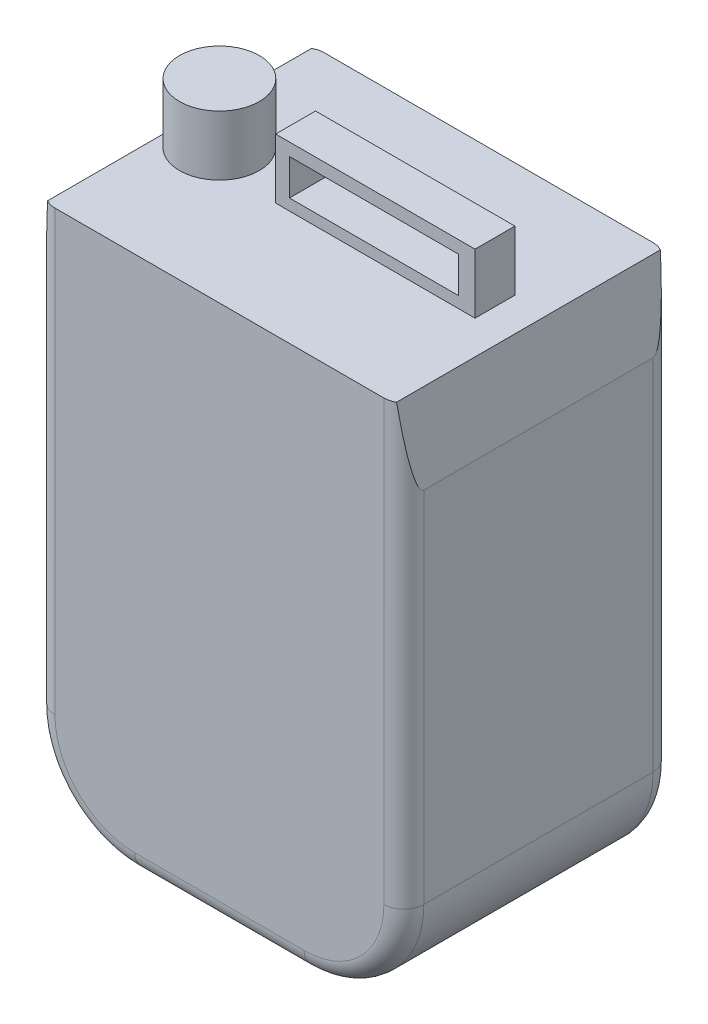
ISO-10303-21;
HEADER;
FILE_DESCRIPTION(('STEP AP214'),'2;1');
FILE_NAME('part.step','',(''),(''),'','','');
FILE_SCHEMA(('AUTOMOTIVE_DESIGN { 1 0 10303 214 1 1 1 1 }'));
ENDSEC;
DATA;
#1=APPLICATION_CONTEXT('core data for automotive mechanical design processes');
#2=APPLICATION_PROTOCOL_DEFINITION('international standard','automotive_design',2000,#1);
#3=PRODUCT_CONTEXT('',#1,'mechanical');
#4=PRODUCT('Part','Part','',(#3));
#5=PRODUCT_RELATED_PRODUCT_CATEGORY('part','',(#4));
#6=PRODUCT_DEFINITION_FORMATION('','',#4);
#7=PRODUCT_DEFINITION_CONTEXT('part definition',#1,'design');
#8=PRODUCT_DEFINITION('design','',#6,#7);
#9=PRODUCT_DEFINITION_SHAPE('','',#8);
#10=(LENGTH_UNIT() NAMED_UNIT(*) SI_UNIT(.MILLI.,.METRE.));
#11=(NAMED_UNIT(*) PLANE_ANGLE_UNIT() SI_UNIT($,.RADIAN.));
#12=(NAMED_UNIT(*) SI_UNIT($,.STERADIAN.) SOLID_ANGLE_UNIT());
#13=UNCERTAINTY_MEASURE_WITH_UNIT(LENGTH_MEASURE(1.E-05),#10,'distance_accuracy_value','');
#14=(GEOMETRIC_REPRESENTATION_CONTEXT(3) GLOBAL_UNCERTAINTY_ASSIGNED_CONTEXT((#13)) GLOBAL_UNIT_ASSIGNED_CONTEXT((#10,
#11,#12)) REPRESENTATION_CONTEXT('',''));
#15=CARTESIAN_POINT('',(0.,0.,0.));
#16=DIRECTION('',(0.,0.,1.));
#17=DIRECTION('',(1.,0.,0.));
#18=AXIS2_PLACEMENT_3D('',#15,#16,#17);
#19=CARTESIAN_POINT('',(-21.4692661721733,234.360279405971,135.));
#20=DIRECTION('',(0.,1.,0.));
#21=DIRECTION('',(0.,0.,1.));
#22=AXIS2_PLACEMENT_3D('',#19,#20,#21);
#23=PLANE('',#22);
#24=DIRECTION('',(1.,0.,0.));
#25=VECTOR('',#24,1.);
#26=CARTESIAN_POINT('',(-21.4692661721733,234.360279405971,0.));
#27=LINE('',#26,#25);
#28=CARTESIAN_POINT('',(-16.4692661721734,234.360279405971,0.));
#29=VERTEX_POINT('',#28);
#30=CARTESIAN_POINT('',(148.530733827827,234.360279405971,0.));
#31=VERTEX_POINT('',#30);
#32=EDGE_CURVE('E258',#29,#31,#27,.T.);
#33=ORIENTED_EDGE('',*,*,#32,.F.);
#34=CARTESIAN_POINT('',(-16.4692661721734,234.360279405971,10.));
#35=DIRECTION('',(0.,1.,0.));
#36=DIRECTION('',(0.,0.,1.));
#37=AXIS2_PLACEMENT_3D('',#34,#35,#36);
#38=CIRCLE('',#37,10.);
#39=CARTESIAN_POINT('',(-21.4692661721733,234.360279405971,1.33974596215564));
#40=VERTEX_POINT('',#39);
#41=EDGE_CURVE('E350',#29,#40,#38,.T.);
#42=ORIENTED_EDGE('',*,*,#41,.T.);
#43=DIRECTION('',(0.,0.,-1.));
#44=VECTOR('',#43,1.);
#45=CARTESIAN_POINT('',(-21.4692661721733,234.360279405971,135.));
#46=LINE('',#45,#44);
#47=CARTESIAN_POINT('',(-21.4692661721734,234.360279405971,67.5));
#48=VERTEX_POINT('',#47);
#49=EDGE_CURVE('E264',#48,#40,#46,.T.);
#50=ORIENTED_EDGE('',*,*,#49,.F.);
#51=CARTESIAN_POINT('',(-1.46926617217336,234.360279405971,67.5));
#52=DIRECTION('',(0.,1.,0.));
#53=DIRECTION('',(0.,0.,1.));
#54=AXIS2_PLACEMENT_3D('',#51,#52,#53);
#55=CIRCLE('',#54,20.);
#56=EDGE_CURVE('E254',#48,#48,#55,.T.);
#57=ORIENTED_EDGE('',*,*,#56,.F.);
#58=CARTESIAN_POINT('',(-21.4692661721733,234.360279405971,133.660254037844));
#59=VERTEX_POINT('',#58);
#60=EDGE_CURVE('E286',#59,#48,#46,.T.);
#61=ORIENTED_EDGE('',*,*,#60,.F.);
#62=CARTESIAN_POINT('',(-16.4692661721734,234.360279405971,125.));
#63=DIRECTION('',(0.,1.,0.));
#64=DIRECTION('',(0.,0.,1.));
#65=AXIS2_PLACEMENT_3D('',#62,#63,#64);
#66=CIRCLE('',#65,10.);
#67=CARTESIAN_POINT('',(-16.4692661721734,234.360279405971,135.));
#68=VERTEX_POINT('',#67);
#69=EDGE_CURVE('E312',#59,#68,#66,.T.);
#70=ORIENTED_EDGE('',*,*,#69,.T.);
#71=DIRECTION('',(1.,0.,0.));
#72=VECTOR('',#71,1.);
#73=CARTESIAN_POINT('',(-21.4692661721733,234.360279405971,135.));
#74=LINE('',#73,#72);
#75=CARTESIAN_POINT('',(148.530733827827,234.360279405971,135.));
#76=VERTEX_POINT('',#75);
#77=EDGE_CURVE('E261',#68,#76,#74,.T.);
#78=ORIENTED_EDGE('',*,*,#77,.T.);
#79=CARTESIAN_POINT('',(148.530733827827,234.360279405971,125.));
#80=DIRECTION('',(0.,1.,0.));
#81=DIRECTION('',(0.,0.,1.));
#82=AXIS2_PLACEMENT_3D('',#79,#80,#81);
#83=CIRCLE('',#82,10.);
#84=CARTESIAN_POINT('',(153.530733827827,234.360279405971,133.660254037844));
#85=VERTEX_POINT('',#84);
#86=EDGE_CURVE('E310',#76,#85,#83,.T.);
#87=ORIENTED_EDGE('',*,*,#86,.T.);
#88=DIRECTION('',(0.,0.,-1.));
#89=VECTOR('',#88,1.);
#90=CARTESIAN_POINT('',(153.530733827827,234.360279405971,135.));
#91=LINE('',#90,#89);
#92=CARTESIAN_POINT('',(153.530733827827,234.360279405971,1.33974596215563));
#93=VERTEX_POINT('',#92);
#94=EDGE_CURVE('E283',#85,#93,#91,.T.);
#95=ORIENTED_EDGE('',*,*,#94,.T.);
#96=CARTESIAN_POINT('',(148.530733827827,234.360279405971,10.));
#97=DIRECTION('',(0.,1.,0.));
#98=DIRECTION('',(0.,0.,1.));
#99=AXIS2_PLACEMENT_3D('',#96,#97,#98);
#100=CIRCLE('',#99,10.);
#101=EDGE_CURVE('E348',#93,#31,#100,.T.);
#102=ORIENTED_EDGE('',*,*,#101,.T.);
#103=EDGE_LOOP('',(#33,#42,#50,#57,#61,#70,#78,#87,#95,#102));
#104=FACE_BOUND('',#103,.T.);
#105=DIRECTION('',(1.,0.,0.));
#106=VECTOR('',#105,1.);
#107=CARTESIAN_POINT('',(36.7357267220525,234.360279405971,77.5));
#108=LINE('',#107,#106);
#109=CARTESIAN_POINT('',(36.7357267220525,234.360279405971,77.5));
#110=VERTEX_POINT('',#109);
#111=CARTESIAN_POINT('',(136.735726722053,234.360279405971,77.5));
#112=VERTEX_POINT('',#111);
#113=EDGE_CURVE('E239',#110,#112,#108,.T.);
#114=ORIENTED_EDGE('',*,*,#113,.F.);
#115=DIRECTION('',(0.,0.,1.));
#116=VECTOR('',#115,1.);
#117=CARTESIAN_POINT('',(36.7357267220525,234.360279405971,57.5));
#118=LINE('',#117,#116);
#119=CARTESIAN_POINT('',(36.7357267220525,234.360279405971,57.5));
#120=VERTEX_POINT('',#119);
#121=EDGE_CURVE('E223',#120,#110,#118,.T.);
#122=ORIENTED_EDGE('',*,*,#121,.F.);
#123=DIRECTION('',(-1.,0.,0.));
#124=VECTOR('',#123,1.);
#125=CARTESIAN_POINT('',(36.7357267220525,234.360279405971,57.5));
#126=LINE('',#125,#124);
#127=CARTESIAN_POINT('',(136.735726722053,234.360279405971,57.5));
#128=VERTEX_POINT('',#127);
#129=EDGE_CURVE('E230',#128,#120,#126,.T.);
#130=ORIENTED_EDGE('',*,*,#129,.F.);
#131=DIRECTION('',(0.,0.,-1.));
#132=VECTOR('',#131,1.);
#133=CARTESIAN_POINT('',(136.735726722053,234.360279405971,57.5));
#134=LINE('',#133,#132);
#135=EDGE_CURVE('E241',#112,#128,#134,.T.);
#136=ORIENTED_EDGE('',*,*,#135,.F.);
#137=EDGE_LOOP('',(#114,#122,#130,#136));
#138=FACE_BOUND('',#137,.T.);
#139=ADVANCED_FACE('F35',(#104,#138),#23,.T.);
#140=CARTESIAN_POINT('',(-26.4692661721734,194.360279405971,135.));
#141=DIRECTION('',(-0.992277876713668,0.124034734589208,0.));
#142=DIRECTION('',(-0.124034734589208,-0.992277876713668,0.));
#143=AXIS2_PLACEMENT_3D('',#140,#141,#142);
#144=PLANE('',#143);
#145=ORIENTED_EDGE('',*,*,#49,.T.);
#146=CARTESIAN_POINT('',(-16.4692661721734,274.360279405971,10.));
#147=DIRECTION('',(-0.992277876713668,0.124034734589208,0.));
#148=DIRECTION('',(-0.124034734589208,-0.992277876713668,0.));
#149=AXIS2_PLACEMENT_3D('',#146,#147,#148);
#150=ELLIPSE('',#149,80.6225774829855,10.);
#151=CARTESIAN_POINT('',(-26.4692661721734,194.360279405971,10.));
#152=VERTEX_POINT('',#151);
#153=EDGE_CURVE('E352',#40,#152,#150,.T.);
#154=ORIENTED_EDGE('',*,*,#153,.T.);
#155=DIRECTION('',(0.,0.,-1.));
#156=VECTOR('',#155,1.);
#157=CARTESIAN_POINT('',(-26.4692661721734,194.360279405971,135.));
#158=LINE('',#157,#156);
#159=CARTESIAN_POINT('',(-26.4692661721734,194.360279405971,125.));
#160=VERTEX_POINT('',#159);
#161=EDGE_CURVE('E267',#160,#152,#158,.T.);
#162=ORIENTED_EDGE('',*,*,#161,.F.);
#163=CARTESIAN_POINT('',(-16.4692661721734,274.360279405971,125.));
#164=DIRECTION('',(-0.992277876713668,0.124034734589208,0.));
#165=DIRECTION('',(0.124034734589208,0.992277876713668,0.));
#166=AXIS2_PLACEMENT_3D('',#163,#164,#165);
#167=ELLIPSE('',#166,80.6225774829855,10.);
#168=EDGE_CURVE('E308',#160,#59,#167,.T.);
#169=ORIENTED_EDGE('',*,*,#168,.T.);
#170=ORIENTED_EDGE('',*,*,#60,.T.);
#171=EDGE_LOOP('',(#145,#154,#162,#169,#170));
#172=FACE_BOUND('',#171,.T.);
#173=ADVANCED_FACE('F435',(#172),#144,.T.);
#174=CARTESIAN_POINT('',(-26.4692661721734,194.360279405971,135.));
#175=DIRECTION('',(1.,0.,0.));
#176=DIRECTION('',(0.,1.,0.));
#177=AXIS2_PLACEMENT_3D('',#174,#175,#176);
#178=PLANE('',#177);
#179=ORIENTED_EDGE('',*,*,#161,.T.);
#180=DIRECTION('',(0.,-1.,0.));
#181=VECTOR('',#180,1.);
#182=CARTESIAN_POINT('',(-26.4692661721734,194.360279405971,10.));
#183=LINE('',#182,#181);
#184=CARTESIAN_POINT('',(-26.4692661721734,14.3602794059717,10.));
#185=VERTEX_POINT('',#184);
#186=EDGE_CURVE('E324',#152,#185,#183,.T.);
#187=ORIENTED_EDGE('',*,*,#186,.T.);
#188=DIRECTION('',(0.,0.,-1.));
#189=VECTOR('',#188,1.);
#190=CARTESIAN_POINT('',(-26.4692661721734,14.3602794059717,135.));
#191=LINE('',#190,#189);
#192=CARTESIAN_POINT('',(-26.4692661721734,14.3602794059717,125.));
#193=VERTEX_POINT('',#192);
#194=EDGE_CURVE('E271',#193,#185,#191,.T.);
#195=ORIENTED_EDGE('',*,*,#194,.F.);
#196=DIRECTION('',(0.,-1.,0.));
#197=VECTOR('',#196,1.);
#198=CARTESIAN_POINT('',(-26.4692661721734,194.360279405971,125.));
#199=LINE('',#198,#197);
#200=EDGE_CURVE('E306',#193,#160,#199,.F.);
#201=ORIENTED_EDGE('',*,*,#200,.T.);
#202=EDGE_LOOP('',(#179,#187,#195,#201));
#203=FACE_BOUND('',#202,.T.);
#204=ADVANCED_FACE('F421',(#203),#178,.F.);
#205=CARTESIAN_POINT('',(23.5307338278266,14.3602794059713,135.));
#206=DIRECTION('',(0.,0.,-1.));
#207=DIRECTION('',(-1.,0.,0.));
#208=AXIS2_PLACEMENT_3D('',#205,#206,#207);
#209=CYLINDRICAL_SURFACE('',#208,50.);
#210=ORIENTED_EDGE('',*,*,#194,.T.);
#211=CARTESIAN_POINT('',(23.5307338278266,14.3602794059713,10.));
#212=DIRECTION('',(0.,0.,1.));
#213=DIRECTION('',(1.,0.,0.));
#214=AXIS2_PLACEMENT_3D('',#211,#212,#213);
#215=CIRCLE('',#214,50.);
#216=CARTESIAN_POINT('',(23.530733827827,-35.6397205940287,10.));
#217=VERTEX_POINT('',#216);
#218=EDGE_CURVE('E354',#185,#217,#215,.T.);
#219=ORIENTED_EDGE('',*,*,#218,.T.);
#220=DIRECTION('',(0.,0.,-1.));
#221=VECTOR('',#220,1.);
#222=CARTESIAN_POINT('',(23.530733827827,-35.6397205940287,135.));
#223=LINE('',#222,#221);
#224=CARTESIAN_POINT('',(23.530733827827,-35.6397205940287,125.));
#225=VERTEX_POINT('',#224);
#226=EDGE_CURVE('E274',#225,#217,#223,.T.);
#227=ORIENTED_EDGE('',*,*,#226,.F.);
#228=CARTESIAN_POINT('',(23.5307338278266,14.3602794059713,125.));
#229=DIRECTION('',(0.,0.,1.));
#230=DIRECTION('',(1.,0.,0.));
#231=AXIS2_PLACEMENT_3D('',#228,#229,#230);
#232=CIRCLE('',#231,50.);
#233=EDGE_CURVE('E314',#225,#193,#232,.F.);
#234=ORIENTED_EDGE('',*,*,#233,.T.);
#235=EDGE_LOOP('',(#210,#219,#227,#234));
#236=FACE_BOUND('',#235,.T.);
#237=ADVANCED_FACE('F411',(#236),#209,.T.);
#238=CARTESIAN_POINT('',(23.530733827827,-35.6397205940287,135.));
#239=DIRECTION('',(0.,1.,0.));
#240=DIRECTION('',(0.,0.,1.));
#241=AXIS2_PLACEMENT_3D('',#238,#239,#240);
#242=PLANE('',#241);
#243=ORIENTED_EDGE('',*,*,#226,.T.);
#244=DIRECTION('',(1.,0.,0.));
#245=VECTOR('',#244,1.);
#246=CARTESIAN_POINT('',(23.530733827827,-35.6397205940287,10.));
#247=LINE('',#246,#245);
#248=CARTESIAN_POINT('',(108.530733827826,-35.6397205940287,10.));
#249=VERTEX_POINT('',#248);
#250=EDGE_CURVE('E356',#217,#249,#247,.T.);
#251=ORIENTED_EDGE('',*,*,#250,.T.);
#252=DIRECTION('',(0.,0.,-1.));
#253=VECTOR('',#252,1.);
#254=CARTESIAN_POINT('',(108.530733827826,-35.6397205940287,135.));
#255=LINE('',#254,#253);
#256=CARTESIAN_POINT('',(108.530733827826,-35.6397205940287,125.));
#257=VERTEX_POINT('',#256);
#258=EDGE_CURVE('E277',#257,#249,#255,.T.);
#259=ORIENTED_EDGE('',*,*,#258,.F.);
#260=DIRECTION('',(1.,0.,0.));
#261=VECTOR('',#260,1.);
#262=CARTESIAN_POINT('',(23.530733827827,-35.6397205940287,125.));
#263=LINE('',#262,#261);
#264=EDGE_CURVE('E316',#257,#225,#263,.F.);
#265=ORIENTED_EDGE('',*,*,#264,.T.);
#266=EDGE_LOOP('',(#243,#251,#259,#265));
#267=FACE_BOUND('',#266,.T.);
#268=ADVANCED_FACE('F409',(#267),#242,.F.);
#269=CARTESIAN_POINT('',(108.530733827827,14.3602794059713,135.));
#270=DIRECTION('',(0.,0.,-1.));
#271=DIRECTION('',(-1.,0.,0.));
#272=AXIS2_PLACEMENT_3D('',#269,#270,#271);
#273=CYLINDRICAL_SURFACE('',#272,50.);
#274=ORIENTED_EDGE('',*,*,#258,.T.);
#275=CARTESIAN_POINT('',(108.530733827827,14.3602794059713,10.));
#276=DIRECTION('',(0.,0.,1.));
#277=DIRECTION('',(1.,0.,0.));
#278=AXIS2_PLACEMENT_3D('',#275,#276,#277);
#279=CIRCLE('',#278,50.);
#280=CARTESIAN_POINT('',(158.530733827827,14.3602794059713,10.));
#281=VERTEX_POINT('',#280);
#282=EDGE_CURVE('E59',#249,#281,#279,.T.);
#283=ORIENTED_EDGE('',*,*,#282,.T.);
#284=DIRECTION('',(0.,0.,-1.));
#285=VECTOR('',#284,1.);
#286=CARTESIAN_POINT('',(158.530733827827,14.3602794059713,135.));
#287=LINE('',#286,#285);
#288=CARTESIAN_POINT('',(158.530733827827,14.3602794059713,125.));
#289=VERTEX_POINT('',#288);
#290=EDGE_CURVE('E279',#289,#281,#287,.T.);
#291=ORIENTED_EDGE('',*,*,#290,.F.);
#292=CARTESIAN_POINT('',(108.530733827827,14.3602794059713,125.));
#293=DIRECTION('',(0.,0.,1.));
#294=DIRECTION('',(1.,0.,0.));
#295=AXIS2_PLACEMENT_3D('',#292,#293,#294);
#296=CIRCLE('',#295,50.);
#297=EDGE_CURVE('E318',#289,#257,#296,.F.);
#298=ORIENTED_EDGE('',*,*,#297,.T.);
#299=EDGE_LOOP('',(#274,#283,#291,#298));
#300=FACE_BOUND('',#299,.T.);
#301=ADVANCED_FACE('F394',(#300),#273,.T.);
#302=CARTESIAN_POINT('',(158.530733827827,194.360279405971,135.));
#303=DIRECTION('',(1.,0.,0.));
#304=DIRECTION('',(0.,1.,0.));
#305=AXIS2_PLACEMENT_3D('',#302,#303,#304);
#306=PLANE('',#305);
#307=ORIENTED_EDGE('',*,*,#290,.T.);
#308=DIRECTION('',(0.,-1.,0.));
#309=VECTOR('',#308,1.);
#310=CARTESIAN_POINT('',(158.530733827827,194.360279405971,10.));
#311=LINE('',#310,#309);
#312=CARTESIAN_POINT('',(158.530733827827,194.360279405971,10.));
#313=VERTEX_POINT('',#312);
#314=EDGE_CURVE('E44',#281,#313,#311,.F.);
#315=ORIENTED_EDGE('',*,*,#314,.T.);
#316=DIRECTION('',(0.,0.,-1.));
#317=VECTOR('',#316,1.);
#318=CARTESIAN_POINT('',(158.530733827827,194.360279405971,135.));
#319=LINE('',#318,#317);
#320=CARTESIAN_POINT('',(158.530733827827,194.360279405971,125.));
#321=VERTEX_POINT('',#320);
#322=EDGE_CURVE('E281',#321,#313,#319,.T.);
#323=ORIENTED_EDGE('',*,*,#322,.F.);
#324=DIRECTION('',(0.,-1.,0.));
#325=VECTOR('',#324,1.);
#326=CARTESIAN_POINT('',(158.530733827827,194.360279405971,125.));
#327=LINE('',#326,#325);
#328=EDGE_CURVE('E320',#321,#289,#327,.T.);
#329=ORIENTED_EDGE('',*,*,#328,.T.);
#330=EDGE_LOOP('',(#307,#315,#323,#329));
#331=FACE_BOUND('',#330,.T.);
#332=ADVANCED_FACE('F393',(#331),#306,.T.);
#333=CARTESIAN_POINT('',(153.530733827827,234.360279405971,135.));
#334=DIRECTION('',(0.992277876713668,0.124034734589207,0.));
#335=DIRECTION('',(-0.124034734589207,0.992277876713668,0.));
#336=AXIS2_PLACEMENT_3D('',#333,#334,#335);
#337=PLANE('',#336);
#338=ORIENTED_EDGE('',*,*,#322,.T.);
#339=CARTESIAN_POINT('',(148.530733827827,274.360279405972,10.));
#340=DIRECTION('',(0.992277876713668,0.124034734589207,0.));
#341=DIRECTION('',(-0.124034734589207,0.992277876713668,0.));
#342=AXIS2_PLACEMENT_3D('',#339,#340,#341);
#343=ELLIPSE('',#342,80.6225774829865,10.);
#344=EDGE_CURVE('E11',#313,#93,#343,.T.);
#345=ORIENTED_EDGE('',*,*,#344,.T.);
#346=ORIENTED_EDGE('',*,*,#94,.F.);
#347=CARTESIAN_POINT('',(148.530733827827,274.360279405972,125.));
#348=DIRECTION('',(0.992277876713668,0.124034734589207,0.));
#349=DIRECTION('',(0.124034734589207,-0.992277876713668,0.));
#350=AXIS2_PLACEMENT_3D('',#347,#348,#349);
#351=ELLIPSE('',#350,80.6225774829865,10.);
#352=EDGE_CURVE('E322',#85,#321,#351,.T.);
#353=ORIENTED_EDGE('',*,*,#352,.T.);
#354=EDGE_LOOP('',(#338,#345,#346,#353));
#355=FACE_BOUND('',#354,.T.);
#356=ADVANCED_FACE('F381',(#355),#337,.T.);
#357=CARTESIAN_POINT('',(108.530733827827,14.3602794059713,135.));
#358=DIRECTION('',(0.,0.,1.));
#359=DIRECTION('',(1.,0.,0.));
#360=AXIS2_PLACEMENT_3D('',#357,#358,#359);
#361=PLANE('',#360);
#362=ORIENTED_EDGE('',*,*,#77,.F.);
#363=DIRECTION('',(0.,-1.,0.));
#364=VECTOR('',#363,1.);
#365=CARTESIAN_POINT('',(-16.4692661721734,14.3602794059717,135.));
#366=LINE('',#365,#364);
#367=CARTESIAN_POINT('',(-16.4692661721734,14.3602794059717,135.));
#368=VERTEX_POINT('',#367);
#369=EDGE_CURVE('E303',#68,#368,#366,.T.);
#370=ORIENTED_EDGE('',*,*,#369,.T.);
#371=CARTESIAN_POINT('',(23.5307338278266,14.3602794059713,135.));
#372=DIRECTION('',(0.,0.,1.));
#373=DIRECTION('',(1.,0.,0.));
#374=AXIS2_PLACEMENT_3D('',#371,#372,#373);
#375=CIRCLE('',#374,40.);
#376=CARTESIAN_POINT('',(23.5307338278269,-25.6397205940287,135.));
#377=VERTEX_POINT('',#376);
#378=EDGE_CURVE('E301',#368,#377,#375,.T.);
#379=ORIENTED_EDGE('',*,*,#378,.T.);
#380=DIRECTION('',(1.,0.,0.));
#381=VECTOR('',#380,1.);
#382=CARTESIAN_POINT('',(108.530733827826,-25.6397205940287,135.));
#383=LINE('',#382,#381);
#384=CARTESIAN_POINT('',(108.530733827826,-25.6397205940287,135.));
#385=VERTEX_POINT('',#384);
#386=EDGE_CURVE('E299',#377,#385,#383,.T.);
#387=ORIENTED_EDGE('',*,*,#386,.T.);
#388=CARTESIAN_POINT('',(108.530733827827,14.3602794059713,135.));
#389=DIRECTION('',(0.,0.,1.));
#390=DIRECTION('',(1.,0.,0.));
#391=AXIS2_PLACEMENT_3D('',#388,#389,#390);
#392=CIRCLE('',#391,40.);
#393=CARTESIAN_POINT('',(148.530733827827,14.3602794059713,135.));
#394=VERTEX_POINT('',#393);
#395=EDGE_CURVE('E297',#385,#394,#392,.T.);
#396=ORIENTED_EDGE('',*,*,#395,.T.);
#397=DIRECTION('',(0.,-1.,0.));
#398=VECTOR('',#397,1.);
#399=CARTESIAN_POINT('',(148.530733827827,14.3602794059713,135.));
#400=LINE('',#399,#398);
#401=EDGE_CURVE('E295',#394,#76,#400,.F.);
#402=ORIENTED_EDGE('',*,*,#401,.T.);
#403=EDGE_LOOP('',(#362,#370,#379,#387,#396,#402));
#404=FACE_BOUND('',#403,.T.);
#405=ADVANCED_FACE('F445',(#404),#361,.T.);
#406=CARTESIAN_POINT('',(108.530733827827,14.3602794059713,0.));
#407=DIRECTION('',(0.,0.,1.));
#408=DIRECTION('',(1.,0.,0.));
#409=AXIS2_PLACEMENT_3D('',#406,#407,#408);
#410=PLANE('',#409);
#411=CARTESIAN_POINT('',(23.5307338278266,14.3602794059713,0.));
#412=DIRECTION('',(0.,0.,1.));
#413=DIRECTION('',(1.,0.,0.));
#414=AXIS2_PLACEMENT_3D('',#411,#412,#413);
#415=CIRCLE('',#414,40.);
#416=CARTESIAN_POINT('',(23.5307338278269,-25.6397205940287,0.));
#417=VERTEX_POINT('',#416);
#418=CARTESIAN_POINT('',(-16.4692661721734,14.3602794059717,0.));
#419=VERTEX_POINT('',#418);
#420=EDGE_CURVE('E344',#417,#419,#415,.F.);
#421=ORIENTED_EDGE('',*,*,#420,.T.);
#422=DIRECTION('',(0.,-1.,0.));
#423=VECTOR('',#422,1.);
#424=CARTESIAN_POINT('',(-16.4692661721734,14.3602794059713,0.));
#425=LINE('',#424,#423);
#426=EDGE_CURVE('E346',#419,#29,#425,.F.);
#427=ORIENTED_EDGE('',*,*,#426,.T.);
#428=ORIENTED_EDGE('',*,*,#32,.T.);
#429=DIRECTION('',(0.,-1.,0.));
#430=VECTOR('',#429,1.);
#431=CARTESIAN_POINT('',(148.530733827827,14.3602794059713,0.));
#432=LINE('',#431,#430);
#433=CARTESIAN_POINT('',(148.530733827827,14.3602794059713,0.));
#434=VERTEX_POINT('',#433);
#435=EDGE_CURVE('E338',#31,#434,#432,.T.);
#436=ORIENTED_EDGE('',*,*,#435,.T.);
#437=CARTESIAN_POINT('',(108.530733827827,14.3602794059713,0.));
#438=DIRECTION('',(0.,0.,1.));
#439=DIRECTION('',(1.,0.,0.));
#440=AXIS2_PLACEMENT_3D('',#437,#438,#439);
#441=CIRCLE('',#440,40.);
#442=CARTESIAN_POINT('',(108.530733827826,-25.6397205940287,0.));
#443=VERTEX_POINT('',#442);
#444=EDGE_CURVE('E340',#434,#443,#441,.F.);
#445=ORIENTED_EDGE('',*,*,#444,.T.);
#446=DIRECTION('',(1.,0.,0.));
#447=VECTOR('',#446,1.);
#448=CARTESIAN_POINT('',(108.530733827827,-25.6397205940287,0.));
#449=LINE('',#448,#447);
#450=EDGE_CURVE('E342',#443,#417,#449,.F.);
#451=ORIENTED_EDGE('',*,*,#450,.T.);
#452=EDGE_LOOP('',(#421,#427,#428,#436,#445,#451));
#453=FACE_BOUND('',#452,.T.);
#454=ADVANCED_FACE('F430',(#453),#410,.F.);
#455=CARTESIAN_POINT('',(-1.46926617217336,264.360279405971,67.5));
#456=DIRECTION('',(0.,-1.,0.));
#457=DIRECTION('',(0.,0.,-1.));
#458=AXIS2_PLACEMENT_3D('',#455,#456,#457);
#459=CYLINDRICAL_SURFACE('',#458,20.);
#460=CARTESIAN_POINT('',(-1.46926617217336,264.360279405971,67.5));
#461=DIRECTION('',(0.,1.,0.));
#462=DIRECTION('',(0.,0.,1.));
#463=AXIS2_PLACEMENT_3D('',#460,#461,#462);
#464=CIRCLE('',#463,20.);
#465=CARTESIAN_POINT('',(-1.46926617217336,264.360279405971,87.5));
#466=VERTEX_POINT('',#465);
#467=EDGE_CURVE('E255',#466,#466,#464,.T.);
#468=ORIENTED_EDGE('',*,*,#467,.F.);
#469=EDGE_LOOP('',(#468));
#470=FACE_BOUND('',#469,.T.);
#471=ORIENTED_EDGE('',*,*,#56,.T.);
#472=EDGE_LOOP('',(#471));
#473=FACE_BOUND('',#472,.T.);
#474=ADVANCED_FACE('F477',(#470,#473),#459,.T.);
#475=CARTESIAN_POINT('',(-1.46926617217336,264.360279405971,67.5));
#476=DIRECTION('',(0.,1.,0.));
#477=DIRECTION('',(0.,0.,1.));
#478=AXIS2_PLACEMENT_3D('',#475,#476,#477);
#479=PLANE('',#478);
#480=ORIENTED_EDGE('',*,*,#467,.T.);
#481=EDGE_LOOP('',(#480));
#482=FACE_BOUND('',#481,.T.);
#483=ADVANCED_FACE('F482',(#482),#479,.T.);
#484=CARTESIAN_POINT('',(36.7357267220525,264.360279405971,57.5));
#485=DIRECTION('',(1.,0.,0.));
#486=DIRECTION('',(0.,0.,-1.));
#487=AXIS2_PLACEMENT_3D('',#484,#485,#486);
#488=PLANE('',#487);
#489=ORIENTED_EDGE('',*,*,#121,.T.);
#490=DIRECTION('',(0.,-1.,0.));
#491=VECTOR('',#490,1.);
#492=CARTESIAN_POINT('',(36.7357267220525,264.360279405971,77.5));
#493=LINE('',#492,#491);
#494=CARTESIAN_POINT('',(36.7357267220525,264.360279405971,77.5));
#495=VERTEX_POINT('',#494);
#496=EDGE_CURVE('E252',#495,#110,#493,.T.);
#497=ORIENTED_EDGE('',*,*,#496,.F.);
#498=DIRECTION('',(0.,0.,1.));
#499=VECTOR('',#498,1.);
#500=CARTESIAN_POINT('',(36.7357267220525,264.360279405971,57.5));
#501=LINE('',#500,#499);
#502=CARTESIAN_POINT('',(36.7357267220525,264.360279405971,57.5));
#503=VERTEX_POINT('',#502);
#504=EDGE_CURVE('E226',#503,#495,#501,.T.);
#505=ORIENTED_EDGE('',*,*,#504,.F.);
#506=DIRECTION('',(0.,-1.,0.));
#507=VECTOR('',#506,1.);
#508=CARTESIAN_POINT('',(36.7357267220525,264.360279405971,57.5));
#509=LINE('',#508,#507);
#510=EDGE_CURVE('E236',#503,#120,#509,.T.);
#511=ORIENTED_EDGE('',*,*,#510,.T.);
#512=EDGE_LOOP('',(#489,#497,#505,#511));
#513=FACE_BOUND('',#512,.T.);
#514=ADVANCED_FACE('F486',(#513),#488,.F.);
#515=CARTESIAN_POINT('',(36.7357267220525,264.360279405971,77.5));
#516=DIRECTION('',(0.,0.,-1.));
#517=DIRECTION('',(-1.,0.,0.));
#518=AXIS2_PLACEMENT_3D('',#515,#516,#517);
#519=PLANE('',#518);
#520=DIRECTION('',(1.,0.,0.));
#521=VECTOR('',#520,1.);
#522=CARTESIAN_POINT('',(43.6591354356621,240.030286499606,77.5));
#523=LINE('',#522,#521);
#524=CARTESIAN_POINT('',(43.6591354356621,240.030286499606,77.5));
#525=VERTEX_POINT('',#524);
#526=CARTESIAN_POINT('',(128.561296548875,240.030286499606,77.5));
#527=VERTEX_POINT('',#526);
#528=EDGE_CURVE('E206',#525,#527,#523,.T.);
#529=ORIENTED_EDGE('',*,*,#528,.F.);
#530=DIRECTION('',(0.,-1.,0.));
#531=VECTOR('',#530,1.);
#532=CARTESIAN_POINT('',(43.6591354356621,258.04524085346,77.5));
#533=LINE('',#532,#531);
#534=CARTESIAN_POINT('',(43.6591354356621,258.04524085346,77.5));
#535=VERTEX_POINT('',#534);
#536=EDGE_CURVE('E211',#535,#525,#533,.T.);
#537=ORIENTED_EDGE('',*,*,#536,.F.);
#538=DIRECTION('',(1.,0.,0.));
#539=VECTOR('',#538,1.);
#540=CARTESIAN_POINT('',(43.6591354356621,258.04524085346,77.5));
#541=LINE('',#540,#539);
#542=CARTESIAN_POINT('',(128.561296548875,258.04524085346,77.5));
#543=VERTEX_POINT('',#542);
#544=EDGE_CURVE('E216',#535,#543,#541,.T.);
#545=ORIENTED_EDGE('',*,*,#544,.T.);
#546=DIRECTION('',(0.,-1.,0.));
#547=VECTOR('',#546,1.);
#548=CARTESIAN_POINT('',(128.561296548875,258.04524085346,77.5));
#549=LINE('',#548,#547);
#550=EDGE_CURVE('E195',#543,#527,#549,.T.);
#551=ORIENTED_EDGE('',*,*,#550,.T.);
#552=EDGE_LOOP('',(#529,#537,#545,#551));
#553=FACE_BOUND('',#552,.T.);
#554=ORIENTED_EDGE('',*,*,#113,.T.);
#555=DIRECTION('',(0.,-1.,0.));
#556=VECTOR('',#555,1.);
#557=CARTESIAN_POINT('',(136.735726722053,264.360279405971,77.5));
#558=LINE('',#557,#556);
#559=CARTESIAN_POINT('',(136.735726722053,264.360279405971,77.5));
#560=VERTEX_POINT('',#559);
#561=EDGE_CURVE('E249',#560,#112,#558,.T.);
#562=ORIENTED_EDGE('',*,*,#561,.F.);
#563=DIRECTION('',(1.,0.,0.));
#564=VECTOR('',#563,1.);
#565=CARTESIAN_POINT('',(36.7357267220525,264.360279405971,77.5));
#566=LINE('',#565,#564);
#567=EDGE_CURVE('E229',#495,#560,#566,.T.);
#568=ORIENTED_EDGE('',*,*,#567,.F.);
#569=ORIENTED_EDGE('',*,*,#496,.T.);
#570=EDGE_LOOP('',(#554,#562,#568,#569));
#571=FACE_BOUND('',#570,.T.);
#572=ADVANCED_FACE('F213',(#553,#571),#519,.F.);
#573=CARTESIAN_POINT('',(136.735726722053,264.360279405971,57.5));
#574=DIRECTION('',(-1.,0.,0.));
#575=DIRECTION('',(0.,0.,1.));
#576=AXIS2_PLACEMENT_3D('',#573,#574,#575);
#577=PLANE('',#576);
#578=ORIENTED_EDGE('',*,*,#135,.T.);
#579=DIRECTION('',(0.,-1.,0.));
#580=VECTOR('',#579,1.);
#581=CARTESIAN_POINT('',(136.735726722053,264.360279405971,57.5));
#582=LINE('',#581,#580);
#583=CARTESIAN_POINT('',(136.735726722053,264.360279405971,57.5));
#584=VERTEX_POINT('',#583);
#585=EDGE_CURVE('E247',#584,#128,#582,.T.);
#586=ORIENTED_EDGE('',*,*,#585,.F.);
#587=DIRECTION('',(0.,0.,-1.));
#588=VECTOR('',#587,1.);
#589=CARTESIAN_POINT('',(136.735726722053,264.360279405971,57.5));
#590=LINE('',#589,#588);
#591=EDGE_CURVE('E232',#560,#584,#590,.T.);
#592=ORIENTED_EDGE('',*,*,#591,.F.);
#593=ORIENTED_EDGE('',*,*,#561,.T.);
#594=EDGE_LOOP('',(#578,#586,#592,#593));
#595=FACE_BOUND('',#594,.T.);
#596=ADVANCED_FACE('F493',(#595),#577,.F.);
#597=CARTESIAN_POINT('',(36.7357267220525,264.360279405971,57.5));
#598=DIRECTION('',(0.,0.,1.));
#599=DIRECTION('',(1.,0.,0.));
#600=AXIS2_PLACEMENT_3D('',#597,#598,#599);
#601=PLANE('',#600);
#602=DIRECTION('',(1.,0.,0.));
#603=VECTOR('',#602,1.);
#604=CARTESIAN_POINT('',(36.7357267220525,258.04524085346,57.5));
#605=LINE('',#604,#603);
#606=CARTESIAN_POINT('',(43.6591354356621,258.04524085346,57.5));
#607=VERTEX_POINT('',#606);
#608=CARTESIAN_POINT('',(128.561296548875,258.04524085346,57.5));
#609=VERTEX_POINT('',#608);
#610=EDGE_CURVE('E290',#607,#609,#605,.T.);
#611=ORIENTED_EDGE('',*,*,#610,.F.);
#612=DIRECTION('',(0.,-1.,0.));
#613=VECTOR('',#612,1.);
#614=CARTESIAN_POINT('',(43.6591354356621,264.360279405971,57.5));
#615=LINE('',#614,#613);
#616=CARTESIAN_POINT('',(43.6591354356621,240.030286499606,57.5));
#617=VERTEX_POINT('',#616);
#618=EDGE_CURVE('E292',#607,#617,#615,.T.);
#619=ORIENTED_EDGE('',*,*,#618,.T.);
#620=DIRECTION('',(1.,0.,0.));
#621=VECTOR('',#620,1.);
#622=CARTESIAN_POINT('',(36.7357267220525,240.030286499606,57.5));
#623=LINE('',#622,#621);
#624=CARTESIAN_POINT('',(128.561296548875,240.030286499606,57.5));
#625=VERTEX_POINT('',#624);
#626=EDGE_CURVE('E270',#617,#625,#623,.T.);
#627=ORIENTED_EDGE('',*,*,#626,.T.);
#628=DIRECTION('',(0.,-1.,0.));
#629=VECTOR('',#628,1.);
#630=CARTESIAN_POINT('',(128.561296548875,264.360279405971,57.5));
#631=LINE('',#630,#629);
#632=EDGE_CURVE('E198',#609,#625,#631,.T.);
#633=ORIENTED_EDGE('',*,*,#632,.F.);
#634=EDGE_LOOP('',(#611,#619,#627,#633));
#635=FACE_BOUND('',#634,.T.);
#636=ORIENTED_EDGE('',*,*,#129,.T.);
#637=ORIENTED_EDGE('',*,*,#510,.F.);
#638=DIRECTION('',(-1.,0.,0.));
#639=VECTOR('',#638,1.);
#640=CARTESIAN_POINT('',(36.7357267220525,264.360279405971,57.5));
#641=LINE('',#640,#639);
#642=EDGE_CURVE('E234',#584,#503,#641,.T.);
#643=ORIENTED_EDGE('',*,*,#642,.F.);
#644=ORIENTED_EDGE('',*,*,#585,.T.);
#645=EDGE_LOOP('',(#636,#637,#643,#644));
#646=FACE_BOUND('',#645,.T.);
#647=ADVANCED_FACE('F496',(#635,#646),#601,.F.);
#648=CARTESIAN_POINT('',(0.,264.360279405971,0.));
#649=DIRECTION('',(0.,1.,0.));
#650=DIRECTION('',(0.,0.,1.));
#651=AXIS2_PLACEMENT_3D('',#648,#649,#650);
#652=PLANE('',#651);
#653=ORIENTED_EDGE('',*,*,#504,.T.);
#654=ORIENTED_EDGE('',*,*,#567,.T.);
#655=ORIENTED_EDGE('',*,*,#591,.T.);
#656=ORIENTED_EDGE('',*,*,#642,.T.);
#657=EDGE_LOOP('',(#653,#654,#655,#656));
#658=FACE_BOUND('',#657,.T.);
#659=ADVANCED_FACE('F500',(#658),#652,.T.);
#660=CARTESIAN_POINT('',(43.6591354356621,258.04524085346,47.5));
#661=DIRECTION('',(-1.,0.,0.));
#662=DIRECTION('',(0.,0.,1.));
#663=AXIS2_PLACEMENT_3D('',#660,#661,#662);
#664=PLANE('',#663);
#665=DIRECTION('',(0.,0.,1.));
#666=VECTOR('',#665,1.);
#667=CARTESIAN_POINT('',(43.6591354356621,258.04524085346,47.5));
#668=LINE('',#667,#666);
#669=EDGE_CURVE('E221',#607,#535,#668,.T.);
#670=ORIENTED_EDGE('',*,*,#669,.T.);
#671=ORIENTED_EDGE('',*,*,#536,.T.);
#672=DIRECTION('',(0.,0.,1.));
#673=VECTOR('',#672,1.);
#674=CARTESIAN_POINT('',(43.6591354356621,240.030286499606,47.5));
#675=LINE('',#674,#673);
#676=EDGE_CURVE('E202',#617,#525,#675,.T.);
#677=ORIENTED_EDGE('',*,*,#676,.F.);
#678=ORIENTED_EDGE('',*,*,#618,.F.);
#679=EDGE_LOOP('',(#670,#671,#677,#678));
#680=FACE_BOUND('',#679,.T.);
#681=ADVANCED_FACE('F504',(#680),#664,.F.);
#682=CARTESIAN_POINT('',(43.6591354356621,258.04524085346,47.5));
#683=DIRECTION('',(0.,-1.,0.));
#684=DIRECTION('',(0.,0.,-1.));
#685=AXIS2_PLACEMENT_3D('',#682,#683,#684);
#686=PLANE('',#685);
#687=ORIENTED_EDGE('',*,*,#610,.T.);
#688=DIRECTION('',(0.,0.,1.));
#689=VECTOR('',#688,1.);
#690=CARTESIAN_POINT('',(128.561296548875,258.04524085346,47.5));
#691=LINE('',#690,#689);
#692=EDGE_CURVE('E201',#609,#543,#691,.T.);
#693=ORIENTED_EDGE('',*,*,#692,.T.);
#694=ORIENTED_EDGE('',*,*,#544,.F.);
#695=ORIENTED_EDGE('',*,*,#669,.F.);
#696=EDGE_LOOP('',(#687,#693,#694,#695));
#697=FACE_BOUND('',#696,.T.);
#698=ADVANCED_FACE('F508',(#697),#686,.T.);
#699=CARTESIAN_POINT('',(128.561296548875,258.04524085346,47.5));
#700=DIRECTION('',(-1.,0.,0.));
#701=DIRECTION('',(0.,0.,1.));
#702=AXIS2_PLACEMENT_3D('',#699,#700,#701);
#703=PLANE('',#702);
#704=ORIENTED_EDGE('',*,*,#632,.T.);
#705=DIRECTION('',(0.,0.,1.));
#706=VECTOR('',#705,1.);
#707=CARTESIAN_POINT('',(128.561296548875,240.030286499606,47.5));
#708=LINE('',#707,#706);
#709=EDGE_CURVE('E190',#625,#527,#708,.T.);
#710=ORIENTED_EDGE('',*,*,#709,.T.);
#711=ORIENTED_EDGE('',*,*,#550,.F.);
#712=ORIENTED_EDGE('',*,*,#692,.F.);
#713=EDGE_LOOP('',(#704,#710,#711,#712));
#714=FACE_BOUND('',#713,.T.);
#715=ADVANCED_FACE('F192',(#714),#703,.T.);
#716=CARTESIAN_POINT('',(43.6591354356621,240.030286499606,47.5));
#717=DIRECTION('',(0.,-1.,0.));
#718=DIRECTION('',(0.,0.,-1.));
#719=AXIS2_PLACEMENT_3D('',#716,#717,#718);
#720=PLANE('',#719);
#721=ORIENTED_EDGE('',*,*,#676,.T.);
#722=ORIENTED_EDGE('',*,*,#528,.T.);
#723=ORIENTED_EDGE('',*,*,#709,.F.);
#724=ORIENTED_EDGE('',*,*,#626,.F.);
#725=EDGE_LOOP('',(#721,#722,#723,#724));
#726=FACE_BOUND('',#725,.T.);
#727=ADVANCED_FACE('F207',(#726),#720,.F.);
#728=CARTESIAN_POINT('',(148.530733827827,194.360279405971,125.));
#729=DIRECTION('',(0.,-1.,0.));
#730=DIRECTION('',(1.,0.,0.));
#731=AXIS2_PLACEMENT_3D('',#728,#729,#730);
#732=CYLINDRICAL_SURFACE('',#731,10.);
#733=ORIENTED_EDGE('',*,*,#86,.F.);
#734=ORIENTED_EDGE('',*,*,#401,.F.);
#735=CARTESIAN_POINT('',(148.530733827827,14.3602794059713,125.));
#736=DIRECTION('',(0.,-1.,0.));
#737=DIRECTION('',(0.,0.,-1.));
#738=AXIS2_PLACEMENT_3D('',#735,#736,#737);
#739=CIRCLE('',#738,10.);
#740=EDGE_CURVE('E333',#289,#394,#739,.T.);
#741=ORIENTED_EDGE('',*,*,#740,.F.);
#742=ORIENTED_EDGE('',*,*,#328,.F.);
#743=ORIENTED_EDGE('',*,*,#352,.F.);
#744=EDGE_LOOP('',(#733,#734,#741,#742,#743));
#745=FACE_BOUND('',#744,.T.);
#746=ADVANCED_FACE('F390',(#745),#732,.T.);
#747=CARTESIAN_POINT('',(108.530733827827,14.3602794059713,125.));
#748=DIRECTION('',(0.,0.,1.));
#749=DIRECTION('',(1.,0.,0.));
#750=AXIS2_PLACEMENT_3D('',#747,#748,#749);
#751=TOROIDAL_SURFACE('',#750,40.,10.);
#752=ORIENTED_EDGE('',*,*,#740,.T.);
#753=ORIENTED_EDGE('',*,*,#395,.F.);
#754=CARTESIAN_POINT('',(108.530733827826,-25.6397205940287,125.));
#755=DIRECTION('',(-1.,0.,0.));
#756=DIRECTION('',(0.,-1.,0.));
#757=AXIS2_PLACEMENT_3D('',#754,#755,#756);
#758=CIRCLE('',#757,10.);
#759=EDGE_CURVE('E330',#257,#385,#758,.T.);
#760=ORIENTED_EDGE('',*,*,#759,.F.);
#761=ORIENTED_EDGE('',*,*,#297,.F.);
#762=EDGE_LOOP('',(#752,#753,#760,#761));
#763=FACE_BOUND('',#762,.T.);
#764=ADVANCED_FACE('F400',(#763),#751,.T.);
#765=CARTESIAN_POINT('',(108.530733827827,-25.6397205940287,125.));
#766=DIRECTION('',(-1.,0.,0.));
#767=DIRECTION('',(0.,0.,1.));
#768=AXIS2_PLACEMENT_3D('',#765,#766,#767);
#769=CYLINDRICAL_SURFACE('',#768,10.);
#770=ORIENTED_EDGE('',*,*,#759,.T.);
#771=ORIENTED_EDGE('',*,*,#386,.F.);
#772=CARTESIAN_POINT('',(23.530733827827,-25.6397205940287,125.));
#773=DIRECTION('',(-1.,0.,0.));
#774=DIRECTION('',(0.,0.,1.));
#775=AXIS2_PLACEMENT_3D('',#772,#773,#774);
#776=CIRCLE('',#775,10.);
#777=EDGE_CURVE('E327',#225,#377,#776,.T.);
#778=ORIENTED_EDGE('',*,*,#777,.F.);
#779=ORIENTED_EDGE('',*,*,#264,.F.);
#780=EDGE_LOOP('',(#770,#771,#778,#779));
#781=FACE_BOUND('',#780,.T.);
#782=ADVANCED_FACE('F405',(#781),#769,.T.);
#783=CARTESIAN_POINT('',(23.5307338278266,14.3602794059713,125.));
#784=DIRECTION('',(0.,0.,1.));
#785=DIRECTION('',(1.,0.,0.));
#786=AXIS2_PLACEMENT_3D('',#783,#784,#785);
#787=TOROIDAL_SURFACE('',#786,40.,10.);
#788=ORIENTED_EDGE('',*,*,#777,.T.);
#789=ORIENTED_EDGE('',*,*,#378,.F.);
#790=CARTESIAN_POINT('',(-16.4692661721734,14.3602794059716,125.));
#791=DIRECTION('',(0.,1.,0.));
#792=DIRECTION('',(0.,0.,1.));
#793=AXIS2_PLACEMENT_3D('',#790,#791,#792);
#794=CIRCLE('',#793,10.);
#795=EDGE_CURVE('E325',#193,#368,#794,.T.);
#796=ORIENTED_EDGE('',*,*,#795,.F.);
#797=ORIENTED_EDGE('',*,*,#233,.F.);
#798=EDGE_LOOP('',(#788,#789,#796,#797));
#799=FACE_BOUND('',#798,.T.);
#800=ADVANCED_FACE('F447',(#799),#787,.T.);
#801=CARTESIAN_POINT('',(-16.4692661721734,14.3602794059713,125.));
#802=DIRECTION('',(0.,1.,0.));
#803=DIRECTION('',(-1.,0.,0.));
#804=AXIS2_PLACEMENT_3D('',#801,#802,#803);
#805=CYLINDRICAL_SURFACE('',#804,10.);
#806=ORIENTED_EDGE('',*,*,#168,.F.);
#807=ORIENTED_EDGE('',*,*,#200,.F.);
#808=ORIENTED_EDGE('',*,*,#795,.T.);
#809=ORIENTED_EDGE('',*,*,#369,.F.);
#810=ORIENTED_EDGE('',*,*,#69,.F.);
#811=EDGE_LOOP('',(#806,#807,#808,#809,#810));
#812=FACE_BOUND('',#811,.T.);
#813=ADVANCED_FACE('F441',(#812),#805,.T.);
#814=CARTESIAN_POINT('',(148.530733827827,14.3602794059713,10.));
#815=DIRECTION('',(0.,1.,0.));
#816=DIRECTION('',(-1.,0.,0.));
#817=AXIS2_PLACEMENT_3D('',#814,#815,#816);
#818=CYLINDRICAL_SURFACE('',#817,10.);
#819=ORIENTED_EDGE('',*,*,#344,.F.);
#820=ORIENTED_EDGE('',*,*,#314,.F.);
#821=CARTESIAN_POINT('',(148.530733827827,14.3602794059713,10.));
#822=DIRECTION('',(0.,-1.,0.));
#823=DIRECTION('',(0.,0.,-1.));
#824=AXIS2_PLACEMENT_3D('',#821,#822,#823);
#825=CIRCLE('',#824,10.);
#826=EDGE_CURVE('E39',#434,#281,#825,.T.);
#827=ORIENTED_EDGE('',*,*,#826,.F.);
#828=ORIENTED_EDGE('',*,*,#435,.F.);
#829=ORIENTED_EDGE('',*,*,#101,.F.);
#830=EDGE_LOOP('',(#819,#820,#827,#828,#829));
#831=FACE_BOUND('',#830,.T.);
#832=ADVANCED_FACE('F37',(#831),#818,.T.);
#833=CARTESIAN_POINT('',(108.530733827827,14.3602794059713,10.));
#834=DIRECTION('',(0.,0.,1.));
#835=DIRECTION('',(1.,0.,0.));
#836=AXIS2_PLACEMENT_3D('',#833,#834,#835);
#837=TOROIDAL_SURFACE('',#836,40.,10.);
#838=ORIENTED_EDGE('',*,*,#826,.T.);
#839=ORIENTED_EDGE('',*,*,#282,.F.);
#840=CARTESIAN_POINT('',(108.530733827826,-25.6397205940287,10.));
#841=DIRECTION('',(-1.,0.,0.));
#842=DIRECTION('',(0.,0.,1.));
#843=AXIS2_PLACEMENT_3D('',#840,#841,#842);
#844=CIRCLE('',#843,10.);
#845=EDGE_CURVE('E364',#443,#249,#844,.T.);
#846=ORIENTED_EDGE('',*,*,#845,.F.);
#847=ORIENTED_EDGE('',*,*,#444,.F.);
#848=EDGE_LOOP('',(#838,#839,#846,#847));
#849=FACE_BOUND('',#848,.T.);
#850=ADVANCED_FACE('F374',(#849),#837,.T.);
#851=CARTESIAN_POINT('',(23.530733827827,-25.6397205940287,10.));
#852=DIRECTION('',(1.,0.,0.));
#853=DIRECTION('',(0.,0.,-1.));
#854=AXIS2_PLACEMENT_3D('',#851,#852,#853);
#855=CYLINDRICAL_SURFACE('',#854,10.);
#856=ORIENTED_EDGE('',*,*,#845,.T.);
#857=ORIENTED_EDGE('',*,*,#250,.F.);
#858=CARTESIAN_POINT('',(23.5307338278269,-25.6397205940287,10.));
#859=DIRECTION('',(-1.,0.,0.));
#860=DIRECTION('',(0.,-1.,0.));
#861=AXIS2_PLACEMENT_3D('',#858,#859,#860);
#862=CIRCLE('',#861,10.);
#863=EDGE_CURVE('E362',#417,#217,#862,.T.);
#864=ORIENTED_EDGE('',*,*,#863,.F.);
#865=ORIENTED_EDGE('',*,*,#450,.F.);
#866=EDGE_LOOP('',(#856,#857,#864,#865));
#867=FACE_BOUND('',#866,.T.);
#868=ADVANCED_FACE('F642',(#867),#855,.T.);
#869=CARTESIAN_POINT('',(23.5307338278266,14.3602794059713,10.));
#870=DIRECTION('',(0.,0.,1.));
#871=DIRECTION('',(1.,0.,0.));
#872=AXIS2_PLACEMENT_3D('',#869,#870,#871);
#873=TOROIDAL_SURFACE('',#872,40.,10.);
#874=ORIENTED_EDGE('',*,*,#863,.T.);
#875=ORIENTED_EDGE('',*,*,#218,.F.);
#876=CARTESIAN_POINT('',(-16.4692661721734,14.3602794059717,10.));
#877=DIRECTION('',(0.,1.,0.));
#878=DIRECTION('',(-1.,0.,0.));
#879=AXIS2_PLACEMENT_3D('',#876,#877,#878);
#880=CIRCLE('',#879,10.);
#881=EDGE_CURVE('E360',#419,#185,#880,.T.);
#882=ORIENTED_EDGE('',*,*,#881,.F.);
#883=ORIENTED_EDGE('',*,*,#420,.F.);
#884=EDGE_LOOP('',(#874,#875,#882,#883));
#885=FACE_BOUND('',#884,.T.);
#886=ADVANCED_FACE('F416',(#885),#873,.T.);
#887=CARTESIAN_POINT('',(-16.4692661721734,194.360279405971,10.));
#888=DIRECTION('',(0.,-1.,0.));
#889=DIRECTION('',(1.,0.,0.));
#890=AXIS2_PLACEMENT_3D('',#887,#888,#889);
#891=CYLINDRICAL_SURFACE('',#890,10.);
#892=ORIENTED_EDGE('',*,*,#41,.F.);
#893=ORIENTED_EDGE('',*,*,#426,.F.);
#894=ORIENTED_EDGE('',*,*,#881,.T.);
#895=ORIENTED_EDGE('',*,*,#186,.F.);
#896=ORIENTED_EDGE('',*,*,#153,.F.);
#897=EDGE_LOOP('',(#892,#893,#894,#895,#896));
#898=FACE_BOUND('',#897,.T.);
#899=ADVANCED_FACE('F427',(#898),#891,.T.);
#900=CLOSED_SHELL('',(#139,#173,#204,#237,#268,#301,#332,#356,#405,#454,#474,#483,#514,#572,
#596,#647,#659,#681,#698,#715,#727,#746,#764,#782,#800,#813,#832,#850,#868,#886,#899));
#901=MANIFOLD_SOLID_BREP('B2',#900);
#902=ADVANCED_BREP_SHAPE_REPRESENTATION('',(#18,#901),#14);
#903=SHAPE_DEFINITION_REPRESENTATION(#9,#902);
ENDSEC;
END-ISO-10303-21;
